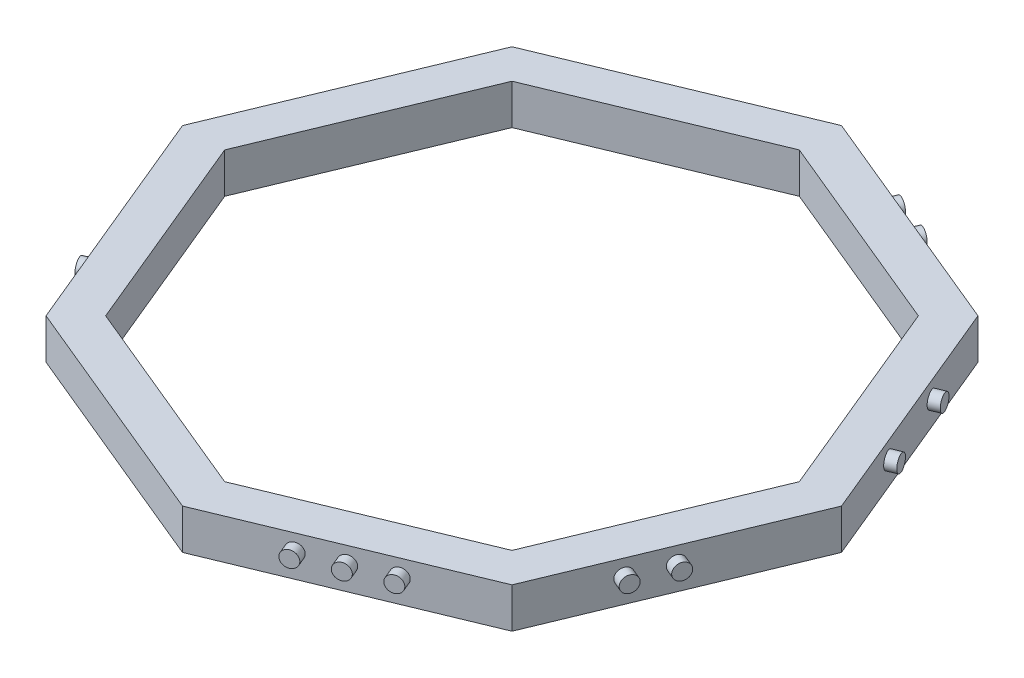
ISO-10303-21;
HEADER;
FILE_DESCRIPTION(('STEP AP214'),'2;1');
FILE_NAME('part.step','',(''),(''),'','','');
FILE_SCHEMA(('AUTOMOTIVE_DESIGN { 1 0 10303 214 1 1 1 1 }'));
ENDSEC;
DATA;
#1=APPLICATION_CONTEXT('core data for automotive mechanical design processes');
#2=APPLICATION_PROTOCOL_DEFINITION('international standard','automotive_design',2000,#1);
#3=PRODUCT_CONTEXT('',#1,'mechanical');
#4=PRODUCT('Part','Part','',(#3));
#5=PRODUCT_RELATED_PRODUCT_CATEGORY('part','',(#4));
#6=PRODUCT_DEFINITION_FORMATION('','',#4);
#7=PRODUCT_DEFINITION_CONTEXT('part definition',#1,'design');
#8=PRODUCT_DEFINITION('design','',#6,#7);
#9=PRODUCT_DEFINITION_SHAPE('','',#8);
#10=(LENGTH_UNIT() NAMED_UNIT(*) SI_UNIT(.MILLI.,.METRE.));
#11=(NAMED_UNIT(*) PLANE_ANGLE_UNIT() SI_UNIT($,.RADIAN.));
#12=(NAMED_UNIT(*) SI_UNIT($,.STERADIAN.) SOLID_ANGLE_UNIT());
#13=UNCERTAINTY_MEASURE_WITH_UNIT(LENGTH_MEASURE(1.E-05),#10,'distance_accuracy_value','');
#14=(GEOMETRIC_REPRESENTATION_CONTEXT(3) GLOBAL_UNCERTAINTY_ASSIGNED_CONTEXT((#13)) GLOBAL_UNIT_ASSIGNED_CONTEXT((#10,
#11,#12)) REPRESENTATION_CONTEXT('',''));
#15=CARTESIAN_POINT('',(0.,0.,0.));
#16=DIRECTION('',(0.,0.,1.));
#17=DIRECTION('',(1.,0.,0.));
#18=AXIS2_PLACEMENT_3D('',#15,#16,#17);
#19=CARTESIAN_POINT('',(28.9913780286488,5.,28.9913780286481));
#20=DIRECTION('',(-0.923879532511291,0.,-0.38268343236508));
#21=DIRECTION('',(-0.38268343236508,0.,0.923879532511291));
#22=AXIS2_PLACEMENT_3D('',#19,#20,#21);
#23=PLANE('',#22);
#24=CARTESIAN_POINT('',(34.9956890143244,3.,14.4956890143238));
#25=DIRECTION('',(-0.923879532511291,0.,-0.38268343236508));
#26=DIRECTION('',(-0.38268343236508,0.,0.923879532511291));
#27=AXIS2_PLACEMENT_3D('',#24,#25,#26);
#28=CIRCLE('',#27,1.);
#29=CARTESIAN_POINT('',(34.6130055819593,3.,15.4195685468351));
#30=VERTEX_POINT('',#29);
#31=EDGE_CURVE('E11',#30,#30,#28,.F.);
#32=ORIENTED_EDGE('',*,*,#31,.F.);
#33=EDGE_LOOP('',(#32));
#34=FACE_BOUND('',#33,.T.);
#35=CARTESIAN_POINT('',(33.082271852499,3.,19.1150866768803));
#36=DIRECTION('',(-0.923879532511291,0.,-0.38268343236508));
#37=DIRECTION('',(-0.38268343236508,0.,0.923879532511291));
#38=AXIS2_PLACEMENT_3D('',#35,#36,#37);
#39=CIRCLE('',#38,1.);
#40=CARTESIAN_POINT('',(32.6995884201339,3.,20.0389662093916));
#41=VERTEX_POINT('',#40);
#42=EDGE_CURVE('E40',#41,#41,#39,.F.);
#43=ORIENTED_EDGE('',*,*,#42,.F.);
#44=EDGE_LOOP('',(#43));
#45=FACE_BOUND('',#44,.T.);
#46=DIRECTION('',(0.38268343236508,0.,-0.923879532511291));
#47=VECTOR('',#46,1.);
#48=CARTESIAN_POINT('',(28.9913780286488,0.,28.9913780286481));
#49=LINE('',#48,#47);
#50=CARTESIAN_POINT('',(28.9913780286488,0.,28.9913780286481));
#51=VERTEX_POINT('',#50);
#52=CARTESIAN_POINT('',(41.,0.,-4.48023070960939E-13));
#53=VERTEX_POINT('',#52);
#54=EDGE_CURVE('E205',#51,#53,#49,.T.);
#55=ORIENTED_EDGE('',*,*,#54,.T.);
#56=DIRECTION('',(0.,-1.,0.));
#57=VECTOR('',#56,1.);
#58=CARTESIAN_POINT('',(41.,5.,-4.48023070960939E-13));
#59=LINE('',#58,#57);
#60=CARTESIAN_POINT('',(41.,5.,-4.48023070960939E-13));
#61=VERTEX_POINT('',#60);
#62=EDGE_CURVE('E271',#61,#53,#59,.T.);
#63=ORIENTED_EDGE('',*,*,#62,.F.);
#64=DIRECTION('',(0.38268343236508,0.,-0.923879532511291));
#65=VECTOR('',#64,1.);
#66=CARTESIAN_POINT('',(28.9913780286488,5.,28.9913780286481));
#67=LINE('',#66,#65);
#68=CARTESIAN_POINT('',(28.9913780286488,5.,28.9913780286481));
#69=VERTEX_POINT('',#68);
#70=EDGE_CURVE('E217',#69,#61,#67,.T.);
#71=ORIENTED_EDGE('',*,*,#70,.F.);
#72=DIRECTION('',(0.,-1.,0.));
#73=VECTOR('',#72,1.);
#74=CARTESIAN_POINT('',(28.9913780286488,5.,28.9913780286481));
#75=LINE('',#74,#73);
#76=EDGE_CURVE('E235',#69,#51,#75,.T.);
#77=ORIENTED_EDGE('',*,*,#76,.T.);
#78=EDGE_LOOP('',(#55,#63,#71,#77));
#79=FACE_BOUND('',#78,.T.);
#80=ADVANCED_FACE('F33',(#34,#45,#79),#23,.F.);
#81=CARTESIAN_POINT('',(41.,5.,-4.48023070960939E-13));
#82=DIRECTION('',(-0.923879532511283,0.,0.3826834323651));
#83=DIRECTION('',(0.3826834323651,0.,0.923879532511283));
#84=AXIS2_PLACEMENT_3D('',#81,#82,#83);
#85=PLANE('',#84);
#86=CARTESIAN_POINT('',(33.0822718524986,3.,-19.115086676881));
#87=DIRECTION('',(-0.923879532511283,0.,0.3826834323651));
#88=DIRECTION('',(0.3826834323651,0.,0.923879532511283));
#89=AXIS2_PLACEMENT_3D('',#86,#87,#88);
#90=CIRCLE('',#89,1.);
#91=CARTESIAN_POINT('',(33.4649552848637,3.,-18.1912071443697));
#92=VERTEX_POINT('',#91);
#93=EDGE_CURVE('E301',#92,#92,#90,.F.);
#94=ORIENTED_EDGE('',*,*,#93,.F.);
#95=EDGE_LOOP('',(#94));
#96=FACE_BOUND('',#95,.T.);
#97=CARTESIAN_POINT('',(36.9091061761496,3.,-9.8762913517682));
#98=DIRECTION('',(-0.923879532511283,0.,0.3826834323651));
#99=DIRECTION('',(0.3826834323651,0.,0.923879532511283));
#100=AXIS2_PLACEMENT_3D('',#97,#98,#99);
#101=CIRCLE('',#100,1.);
#102=CARTESIAN_POINT('',(37.2917896085147,3.,-8.95241181925691));
#103=VERTEX_POINT('',#102);
#104=EDGE_CURVE('E298',#103,#103,#101,.F.);
#105=ORIENTED_EDGE('',*,*,#104,.F.);
#106=EDGE_LOOP('',(#105));
#107=FACE_BOUND('',#106,.T.);
#108=DIRECTION('',(-0.3826834323651,0.,-0.923879532511283));
#109=VECTOR('',#108,1.);
#110=CARTESIAN_POINT('',(41.,0.,-4.48023070960939E-13));
#111=LINE('',#110,#109);
#112=CARTESIAN_POINT('',(28.9913780286481,0.,-28.9913780286488));
#113=VERTEX_POINT('',#112);
#114=EDGE_CURVE('E238',#53,#113,#111,.T.);
#115=ORIENTED_EDGE('',*,*,#114,.T.);
#116=DIRECTION('',(0.,-1.,0.));
#117=VECTOR('',#116,1.);
#118=CARTESIAN_POINT('',(28.9913780286481,5.,-28.9913780286488));
#119=LINE('',#118,#117);
#120=CARTESIAN_POINT('',(28.9913780286481,5.,-28.9913780286488));
#121=VERTEX_POINT('',#120);
#122=EDGE_CURVE('E268',#121,#113,#119,.T.);
#123=ORIENTED_EDGE('',*,*,#122,.F.);
#124=DIRECTION('',(-0.3826834323651,0.,-0.923879532511283));
#125=VECTOR('',#124,1.);
#126=CARTESIAN_POINT('',(41.,5.,-4.48023070960939E-13));
#127=LINE('',#126,#125);
#128=EDGE_CURVE('E220',#61,#121,#127,.T.);
#129=ORIENTED_EDGE('',*,*,#128,.F.);
#130=ORIENTED_EDGE('',*,*,#62,.T.);
#131=EDGE_LOOP('',(#115,#123,#129,#130));
#132=FACE_BOUND('',#131,.T.);
#133=ADVANCED_FACE('F310',(#96,#107,#132),#85,.F.);
#134=CARTESIAN_POINT('',(28.9913780286481,5.,-28.9913780286488));
#135=DIRECTION('',(-0.38268343236508,0.,0.923879532511291));
#136=DIRECTION('',(0.923879532511291,0.,0.38268343236508));
#137=AXIS2_PLACEMENT_3D('',#134,#135,#136);
#138=PLANE('',#137);
#139=CARTESIAN_POINT('',(9.87629135176739,3.,-36.9091061761498));
#140=DIRECTION('',(-0.38268343236508,0.,0.923879532511291));
#141=DIRECTION('',(0.923879532511291,0.,0.38268343236508));
#142=AXIS2_PLACEMENT_3D('',#139,#140,#141);
#143=CIRCLE('',#142,0.999999999999998);
#144=CARTESIAN_POINT('',(10.8001708842787,3.,-36.5264227437847));
#145=VERTEX_POINT('',#144);
#146=EDGE_CURVE('E295',#145,#145,#143,.F.);
#147=ORIENTED_EDGE('',*,*,#146,.F.);
#148=EDGE_LOOP('',(#147));
#149=FACE_BOUND('',#148,.T.);
#150=CARTESIAN_POINT('',(14.4956890143238,3.,-34.9956890143244));
#151=DIRECTION('',(-0.38268343236508,0.,0.923879532511291));
#152=DIRECTION('',(0.923879532511291,0.,0.38268343236508));
#153=AXIS2_PLACEMENT_3D('',#150,#151,#152);
#154=CIRCLE('',#153,1.);
#155=CARTESIAN_POINT('',(15.4195685468351,3.,-34.6130055819593));
#156=VERTEX_POINT('',#155);
#157=EDGE_CURVE('E292',#156,#156,#154,.F.);
#158=ORIENTED_EDGE('',*,*,#157,.F.);
#159=EDGE_LOOP('',(#158));
#160=FACE_BOUND('',#159,.T.);
#161=DIRECTION('',(-0.923879532511291,0.,-0.38268343236508));
#162=VECTOR('',#161,1.);
#163=CARTESIAN_POINT('',(28.9913780286481,0.,-28.9913780286488));
#164=LINE('',#163,#162);
#165=CARTESIAN_POINT('',(-4.51771650624012E-13,0.,-41.));
#166=VERTEX_POINT('',#165);
#167=EDGE_CURVE('E240',#113,#166,#164,.T.);
#168=ORIENTED_EDGE('',*,*,#167,.T.);
#169=DIRECTION('',(0.,-1.,0.));
#170=VECTOR('',#169,1.);
#171=CARTESIAN_POINT('',(-4.51771650624012E-13,5.,-41.));
#172=LINE('',#171,#170);
#173=CARTESIAN_POINT('',(-4.51771650624012E-13,5.,-41.));
#174=VERTEX_POINT('',#173);
#175=EDGE_CURVE('E265',#174,#166,#172,.T.);
#176=ORIENTED_EDGE('',*,*,#175,.F.);
#177=DIRECTION('',(-0.923879532511291,0.,-0.38268343236508));
#178=VECTOR('',#177,1.);
#179=CARTESIAN_POINT('',(28.9913780286481,5.,-28.9913780286488));
#180=LINE('',#179,#178);
#181=EDGE_CURVE('E223',#121,#174,#180,.T.);
#182=ORIENTED_EDGE('',*,*,#181,.F.);
#183=ORIENTED_EDGE('',*,*,#122,.T.);
#184=EDGE_LOOP('',(#168,#176,#182,#183));
#185=FACE_BOUND('',#184,.T.);
#186=ADVANCED_FACE('F348',(#149,#160,#185),#138,.F.);
#187=CARTESIAN_POINT('',(-4.51771650624012E-13,5.,-41.));
#188=DIRECTION('',(0.3826834323651,0.,0.923879532511283));
#189=DIRECTION('',(0.923879532511283,0.,-0.3826834323651));
#190=AXIS2_PLACEMENT_3D('',#187,#188,#189);
#191=PLANE('',#190);
#192=CARTESIAN_POINT('',(-9.8762913517682,3.,-36.9091061761496));
#193=DIRECTION('',(0.3826834323651,0.,0.923879532511283));
#194=DIRECTION('',(0.923879532511283,0.,-0.3826834323651));
#195=AXIS2_PLACEMENT_3D('',#192,#193,#194);
#196=CIRCLE('',#195,1.);
#197=CARTESIAN_POINT('',(-8.95241181925692,3.,-37.2917896085147));
#198=VERTEX_POINT('',#197);
#199=EDGE_CURVE('E289',#198,#198,#196,.F.);
#200=ORIENTED_EDGE('',*,*,#199,.F.);
#201=EDGE_LOOP('',(#200));
#202=FACE_BOUND('',#201,.T.);
#203=DIRECTION('',(-0.923879532511283,0.,0.3826834323651));
#204=VECTOR('',#203,1.);
#205=CARTESIAN_POINT('',(-4.51771650624012E-13,0.,-41.));
#206=LINE('',#205,#204);
#207=CARTESIAN_POINT('',(-28.9913780286488,0.,-28.9913780286481));
#208=VERTEX_POINT('',#207);
#209=EDGE_CURVE('E242',#166,#208,#206,.T.);
#210=ORIENTED_EDGE('',*,*,#209,.T.);
#211=DIRECTION('',(0.,-1.,0.));
#212=VECTOR('',#211,1.);
#213=CARTESIAN_POINT('',(-28.9913780286488,5.,-28.9913780286481));
#214=LINE('',#213,#212);
#215=CARTESIAN_POINT('',(-28.9913780286488,5.,-28.9913780286481));
#216=VERTEX_POINT('',#215);
#217=EDGE_CURVE('E262',#216,#208,#214,.T.);
#218=ORIENTED_EDGE('',*,*,#217,.F.);
#219=DIRECTION('',(-0.923879532511283,0.,0.3826834323651));
#220=VECTOR('',#219,1.);
#221=CARTESIAN_POINT('',(-4.51771650624012E-13,5.,-41.));
#222=LINE('',#221,#220);
#223=EDGE_CURVE('E225',#174,#216,#222,.T.);
#224=ORIENTED_EDGE('',*,*,#223,.F.);
#225=ORIENTED_EDGE('',*,*,#175,.T.);
#226=EDGE_LOOP('',(#210,#218,#224,#225));
#227=FACE_BOUND('',#226,.T.);
#228=ADVANCED_FACE('F345',(#202,#227),#191,.F.);
#229=CARTESIAN_POINT('',(-28.9913780286488,5.,-28.9913780286481));
#230=DIRECTION('',(0.923879532511291,0.,0.38268343236508));
#231=DIRECTION('',(0.38268343236508,0.,-0.923879532511291));
#232=AXIS2_PLACEMENT_3D('',#229,#230,#231);
#233=PLANE('',#232);
#234=CARTESIAN_POINT('',(-34.9956890143244,3.,-14.4956890143239));
#235=DIRECTION('',(0.923879532511291,0.,0.38268343236508));
#236=DIRECTION('',(0.38268343236508,0.,-0.923879532511291));
#237=AXIS2_PLACEMENT_3D('',#234,#235,#236);
#238=CIRCLE('',#237,0.999999999999998);
#239=CARTESIAN_POINT('',(-34.6130055819593,3.,-15.4195685468351));
#240=VERTEX_POINT('',#239);
#241=EDGE_CURVE('E286',#240,#240,#238,.F.);
#242=ORIENTED_EDGE('',*,*,#241,.F.);
#243=EDGE_LOOP('',(#242));
#244=FACE_BOUND('',#243,.T.);
#245=DIRECTION('',(-0.38268343236508,0.,0.923879532511291));
#246=VECTOR('',#245,1.);
#247=CARTESIAN_POINT('',(-28.9913780286488,0.,-28.9913780286481));
#248=LINE('',#247,#246);
#249=CARTESIAN_POINT('',(-41.,0.,4.3736829323662E-13));
#250=VERTEX_POINT('',#249);
#251=EDGE_CURVE('E244',#208,#250,#248,.T.);
#252=ORIENTED_EDGE('',*,*,#251,.T.);
#253=DIRECTION('',(0.,-1.,0.));
#254=VECTOR('',#253,1.);
#255=CARTESIAN_POINT('',(-41.,5.,4.3736829323662E-13));
#256=LINE('',#255,#254);
#257=CARTESIAN_POINT('',(-41.,5.,4.3736829323662E-13));
#258=VERTEX_POINT('',#257);
#259=EDGE_CURVE('E259',#258,#250,#256,.T.);
#260=ORIENTED_EDGE('',*,*,#259,.F.);
#261=DIRECTION('',(-0.38268343236508,0.,0.923879532511291));
#262=VECTOR('',#261,1.);
#263=CARTESIAN_POINT('',(-28.9913780286488,5.,-28.9913780286481));
#264=LINE('',#263,#262);
#265=EDGE_CURVE('E227',#216,#258,#264,.T.);
#266=ORIENTED_EDGE('',*,*,#265,.F.);
#267=ORIENTED_EDGE('',*,*,#217,.T.);
#268=EDGE_LOOP('',(#252,#260,#266,#267));
#269=FACE_BOUND('',#268,.T.);
#270=ADVANCED_FACE('F341',(#244,#269),#233,.F.);
#271=CARTESIAN_POINT('',(-41.,5.,4.3736829323662E-13));
#272=DIRECTION('',(0.923879532511283,0.,-0.3826834323651));
#273=DIRECTION('',(-0.3826834323651,0.,-0.923879532511283));
#274=AXIS2_PLACEMENT_3D('',#271,#272,#273);
#275=PLANE('',#274);
#276=CARTESIAN_POINT('',(-33.0822718524986,3.,19.115086676881));
#277=DIRECTION('',(0.923879532511283,0.,-0.3826834323651));
#278=DIRECTION('',(-0.3826834323651,0.,-0.923879532511283));
#279=AXIS2_PLACEMENT_3D('',#276,#277,#278);
#280=CIRCLE('',#279,1.);
#281=CARTESIAN_POINT('',(-33.4649552848637,3.,18.1912071443697));
#282=VERTEX_POINT('',#281);
#283=EDGE_CURVE('E283',#282,#282,#280,.F.);
#284=ORIENTED_EDGE('',*,*,#283,.F.);
#285=EDGE_LOOP('',(#284));
#286=FACE_BOUND('',#285,.T.);
#287=DIRECTION('',(0.3826834323651,0.,0.923879532511283));
#288=VECTOR('',#287,1.);
#289=CARTESIAN_POINT('',(-41.,0.,4.3736829323662E-13));
#290=LINE('',#289,#288);
#291=CARTESIAN_POINT('',(-28.9913780286481,0.,28.9913780286488));
#292=VERTEX_POINT('',#291);
#293=EDGE_CURVE('E246',#250,#292,#290,.T.);
#294=ORIENTED_EDGE('',*,*,#293,.T.);
#295=DIRECTION('',(0.,-1.,0.));
#296=VECTOR('',#295,1.);
#297=CARTESIAN_POINT('',(-28.9913780286481,5.,28.9913780286488));
#298=LINE('',#297,#296);
#299=CARTESIAN_POINT('',(-28.9913780286481,5.,28.9913780286488));
#300=VERTEX_POINT('',#299);
#301=EDGE_CURVE('E256',#300,#292,#298,.T.);
#302=ORIENTED_EDGE('',*,*,#301,.F.);
#303=DIRECTION('',(0.3826834323651,0.,0.923879532511283));
#304=VECTOR('',#303,1.);
#305=CARTESIAN_POINT('',(-41.,5.,4.3736829323662E-13));
#306=LINE('',#305,#304);
#307=EDGE_CURVE('E229',#258,#300,#306,.T.);
#308=ORIENTED_EDGE('',*,*,#307,.F.);
#309=ORIENTED_EDGE('',*,*,#259,.T.);
#310=EDGE_LOOP('',(#294,#302,#308,#309));
#311=FACE_BOUND('',#310,.T.);
#312=ADVANCED_FACE('F336',(#286,#311),#275,.F.);
#313=CARTESIAN_POINT('',(-28.9913780286481,5.,28.9913780286488));
#314=DIRECTION('',(0.382683432365079,0.,-0.923879532511291));
#315=DIRECTION('',(-0.923879532511291,0.,-0.382683432365079));
#316=AXIS2_PLACEMENT_3D('',#313,#314,#315);
#317=PLANE('',#316);
#318=DIRECTION('',(0.923879532511291,0.,0.382683432365079));
#319=VECTOR('',#318,1.);
#320=CARTESIAN_POINT('',(-28.9913780286481,0.,28.9913780286488));
#321=LINE('',#320,#319);
#322=CARTESIAN_POINT('',(4.40747933146162E-13,0.,41.));
#323=VERTEX_POINT('',#322);
#324=EDGE_CURVE('E248',#292,#323,#321,.T.);
#325=ORIENTED_EDGE('',*,*,#324,.T.);
#326=DIRECTION('',(0.,-1.,0.));
#327=VECTOR('',#326,1.);
#328=CARTESIAN_POINT('',(4.40747933146162E-13,5.,41.));
#329=LINE('',#328,#327);
#330=CARTESIAN_POINT('',(4.40747933146162E-13,5.,41.));
#331=VERTEX_POINT('',#330);
#332=EDGE_CURVE('E253',#331,#323,#329,.T.);
#333=ORIENTED_EDGE('',*,*,#332,.F.);
#334=DIRECTION('',(0.923879532511291,0.,0.382683432365079));
#335=VECTOR('',#334,1.);
#336=CARTESIAN_POINT('',(-28.9913780286481,5.,28.9913780286488));
#337=LINE('',#336,#335);
#338=EDGE_CURVE('E231',#300,#331,#337,.T.);
#339=ORIENTED_EDGE('',*,*,#338,.F.);
#340=ORIENTED_EDGE('',*,*,#301,.T.);
#341=EDGE_LOOP('',(#325,#333,#339,#340));
#342=FACE_BOUND('',#341,.T.);
#343=ADVANCED_FACE('F331',(#342),#317,.F.);
#344=CARTESIAN_POINT('',(4.40747933146162E-13,5.,41.));
#345=DIRECTION('',(-0.3826834323651,0.,-0.923879532511283));
#346=DIRECTION('',(-0.923879532511283,0.,0.3826834323651));
#347=AXIS2_PLACEMENT_3D('',#344,#345,#346);
#348=PLANE('',#347);
#349=CARTESIAN_POINT('',(14.4956890143246,3.,34.9956890143241));
#350=DIRECTION('',(-0.3826834323651,0.,-0.923879532511283));
#351=DIRECTION('',(-0.923879532511283,0.,0.3826834323651));
#352=AXIS2_PLACEMENT_3D('',#349,#350,#351);
#353=CIRCLE('',#352,1.);
#354=CARTESIAN_POINT('',(13.5718094818133,3.,35.3783724466892));
#355=VERTEX_POINT('',#354);
#356=EDGE_CURVE('E280',#355,#355,#353,.F.);
#357=ORIENTED_EDGE('',*,*,#356,.F.);
#358=EDGE_LOOP('',(#357));
#359=FACE_BOUND('',#358,.T.);
#360=CARTESIAN_POINT('',(9.87629135176818,3.,36.9091061761496));
#361=DIRECTION('',(-0.3826834323651,0.,-0.923879532511283));
#362=DIRECTION('',(-0.923879532511283,0.,0.3826834323651));
#363=AXIS2_PLACEMENT_3D('',#360,#361,#362);
#364=CIRCLE('',#363,1.);
#365=CARTESIAN_POINT('',(8.9524118192569,3.,37.2917896085147));
#366=VERTEX_POINT('',#365);
#367=EDGE_CURVE('E277',#366,#366,#364,.F.);
#368=ORIENTED_EDGE('',*,*,#367,.F.);
#369=EDGE_LOOP('',(#368));
#370=FACE_BOUND('',#369,.T.);
#371=CARTESIAN_POINT('',(19.115086676881,3.,33.0822718524986));
#372=DIRECTION('',(-0.3826834323651,0.,-0.923879532511283));
#373=DIRECTION('',(-0.923879532511283,0.,0.3826834323651));
#374=AXIS2_PLACEMENT_3D('',#371,#372,#373);
#375=CIRCLE('',#374,1.);
#376=CARTESIAN_POINT('',(18.1912071443697,3.,33.4649552848637));
#377=VERTEX_POINT('',#376);
#378=EDGE_CURVE('E274',#377,#377,#375,.F.);
#379=ORIENTED_EDGE('',*,*,#378,.F.);
#380=EDGE_LOOP('',(#379));
#381=FACE_BOUND('',#380,.T.);
#382=DIRECTION('',(0.923879532511283,0.,-0.3826834323651));
#383=VECTOR('',#382,1.);
#384=CARTESIAN_POINT('',(4.40747933146162E-13,0.,41.));
#385=LINE('',#384,#383);
#386=EDGE_CURVE('E221',#323,#51,#385,.T.);
#387=ORIENTED_EDGE('',*,*,#386,.T.);
#388=ORIENTED_EDGE('',*,*,#76,.F.);
#389=DIRECTION('',(0.923879532511283,0.,-0.3826834323651));
#390=VECTOR('',#389,1.);
#391=CARTESIAN_POINT('',(4.40747933146162E-13,5.,41.));
#392=LINE('',#391,#390);
#393=EDGE_CURVE('E233',#331,#69,#392,.T.);
#394=ORIENTED_EDGE('',*,*,#393,.F.);
#395=ORIENTED_EDGE('',*,*,#332,.T.);
#396=EDGE_LOOP('',(#387,#388,#394,#395));
#397=FACE_BOUND('',#396,.T.);
#398=ADVANCED_FACE('F329',(#359,#370,#381,#397),#348,.F.);
#399=CARTESIAN_POINT('',(0.,5.,0.));
#400=DIRECTION('',(0.,1.,0.));
#401=DIRECTION('',(0.,0.,1.));
#402=AXIS2_PLACEMENT_3D('',#399,#400,#401);
#403=PLANE('',#402);
#404=DIRECTION('',(0.382683432365079,0.,-0.923879532511291));
#405=VECTOR('',#404,1.);
#406=CARTESIAN_POINT('',(25.2790674274194,5.,25.2790674274188));
#407=LINE('',#406,#405);
#408=CARTESIAN_POINT('',(25.2790674274194,5.,25.2790674274188));
#409=VERTEX_POINT('',#408);
#410=CARTESIAN_POINT('',(35.75,5.,-4.16333634234434E-13));
#411=VERTEX_POINT('',#410);
#412=EDGE_CURVE('E47',#409,#411,#407,.T.);
#413=ORIENTED_EDGE('',*,*,#412,.F.);
#414=DIRECTION('',(0.923879532511282,0.,-0.3826834323651));
#415=VECTOR('',#414,1.);
#416=CARTESIAN_POINT('',(4.22971071691175E-13,5.,35.75));
#417=LINE('',#416,#415);
#418=CARTESIAN_POINT('',(4.22971071691175E-13,5.,35.75));
#419=VERTEX_POINT('',#418);
#420=EDGE_CURVE('E164',#419,#409,#417,.T.);
#421=ORIENTED_EDGE('',*,*,#420,.F.);
#422=DIRECTION('',(0.923879532511291,0.,0.382683432365079));
#423=VECTOR('',#422,1.);
#424=CARTESIAN_POINT('',(-25.2790674274188,5.,25.2790674274194));
#425=LINE('',#424,#423);
#426=CARTESIAN_POINT('',(-25.2790674274188,5.,25.2790674274194));
#427=VERTEX_POINT('',#426);
#428=EDGE_CURVE('E167',#427,#419,#425,.T.);
#429=ORIENTED_EDGE('',*,*,#428,.F.);
#430=DIRECTION('',(0.382683432365101,0.,0.923879532511282));
#431=VECTOR('',#430,1.);
#432=CARTESIAN_POINT('',(-35.75,5.,4.23238986687175E-13));
#433=LINE('',#432,#431);
#434=CARTESIAN_POINT('',(-35.75,5.,4.23238986687175E-13));
#435=VERTEX_POINT('',#434);
#436=EDGE_CURVE('E198',#435,#427,#433,.T.);
#437=ORIENTED_EDGE('',*,*,#436,.F.);
#438=DIRECTION('',(-0.382683432365079,0.,0.923879532511291));
#439=VECTOR('',#438,1.);
#440=CARTESIAN_POINT('',(-25.2790674274194,5.,-25.2790674274188));
#441=LINE('',#440,#439);
#442=CARTESIAN_POINT('',(-25.2790674274194,5.,-25.2790674274188));
#443=VERTEX_POINT('',#442);
#444=EDGE_CURVE('E195',#443,#435,#441,.T.);
#445=ORIENTED_EDGE('',*,*,#444,.F.);
#446=DIRECTION('',(-0.923879532511282,0.,0.3826834323651));
#447=VECTOR('',#446,1.);
#448=CARTESIAN_POINT('',(-4.16338199698302E-13,5.,-35.75));
#449=LINE('',#448,#447);
#450=CARTESIAN_POINT('',(-4.16338199698302E-13,5.,-35.75));
#451=VERTEX_POINT('',#450);
#452=EDGE_CURVE('E192',#451,#443,#449,.T.);
#453=ORIENTED_EDGE('',*,*,#452,.F.);
#454=DIRECTION('',(-0.923879532511291,0.,-0.382683432365079));
#455=VECTOR('',#454,1.);
#456=CARTESIAN_POINT('',(25.2790674274188,5.,-25.2790674274194));
#457=LINE('',#456,#455);
#458=CARTESIAN_POINT('',(25.2790674274188,5.,-25.2790674274194));
#459=VERTEX_POINT('',#458);
#460=EDGE_CURVE('E189',#459,#451,#457,.T.);
#461=ORIENTED_EDGE('',*,*,#460,.F.);
#462=DIRECTION('',(-0.382683432365101,0.,-0.923879532511282));
#463=VECTOR('',#462,1.);
#464=CARTESIAN_POINT('',(35.75,5.,-4.15771681559117E-13));
#465=LINE('',#464,#463);
#466=EDGE_CURVE('E187',#411,#459,#465,.T.);
#467=ORIENTED_EDGE('',*,*,#466,.F.);
#468=EDGE_LOOP('',(#413,#421,#429,#437,#445,#453,#461,#467));
#469=FACE_BOUND('',#468,.T.);
#470=ORIENTED_EDGE('',*,*,#70,.T.);
#471=ORIENTED_EDGE('',*,*,#128,.T.);
#472=ORIENTED_EDGE('',*,*,#181,.T.);
#473=ORIENTED_EDGE('',*,*,#223,.T.);
#474=ORIENTED_EDGE('',*,*,#265,.T.);
#475=ORIENTED_EDGE('',*,*,#307,.T.);
#476=ORIENTED_EDGE('',*,*,#338,.T.);
#477=ORIENTED_EDGE('',*,*,#393,.T.);
#478=EDGE_LOOP('',(#470,#471,#472,#473,#474,#475,#476,#477));
#479=FACE_BOUND('',#478,.T.);
#480=ADVANCED_FACE('F324',(#469,#479),#403,.T.);
#481=CARTESIAN_POINT('',(0.,0.,0.));
#482=DIRECTION('',(0.,1.,0.));
#483=DIRECTION('',(0.,0.,1.));
#484=AXIS2_PLACEMENT_3D('',#481,#482,#483);
#485=PLANE('',#484);
#486=DIRECTION('',(0.923879532511282,0.,-0.3826834323651));
#487=VECTOR('',#486,1.);
#488=CARTESIAN_POINT('',(4.22971071691175E-13,0.,35.75));
#489=LINE('',#488,#487);
#490=CARTESIAN_POINT('',(4.22971071691175E-13,0.,35.75));
#491=VERTEX_POINT('',#490);
#492=CARTESIAN_POINT('',(25.2790674274194,0.,25.2790674274188));
#493=VERTEX_POINT('',#492);
#494=EDGE_CURVE('E153',#491,#493,#489,.T.);
#495=ORIENTED_EDGE('',*,*,#494,.T.);
#496=DIRECTION('',(0.382683432365079,0.,-0.923879532511291));
#497=VECTOR('',#496,1.);
#498=CARTESIAN_POINT('',(25.2790674274194,0.,25.2790674274188));
#499=LINE('',#498,#497);
#500=CARTESIAN_POINT('',(35.75,0.,-4.15771681559117E-13));
#501=VERTEX_POINT('',#500);
#502=EDGE_CURVE('E147',#493,#501,#499,.T.);
#503=ORIENTED_EDGE('',*,*,#502,.T.);
#504=DIRECTION('',(-0.382683432365101,0.,-0.923879532511282));
#505=VECTOR('',#504,1.);
#506=CARTESIAN_POINT('',(35.75,0.,-4.15771681559117E-13));
#507=LINE('',#506,#505);
#508=CARTESIAN_POINT('',(25.2790674274188,0.,-25.2790674274194));
#509=VERTEX_POINT('',#508);
#510=EDGE_CURVE('E156',#501,#509,#507,.T.);
#511=ORIENTED_EDGE('',*,*,#510,.T.);
#512=DIRECTION('',(-0.923879532511291,0.,-0.382683432365079));
#513=VECTOR('',#512,1.);
#514=CARTESIAN_POINT('',(25.2790674274188,0.,-25.2790674274194));
#515=LINE('',#514,#513);
#516=CARTESIAN_POINT('',(-4.16338199698302E-13,0.,-35.75));
#517=VERTEX_POINT('',#516);
#518=EDGE_CURVE('E55',#509,#517,#515,.T.);
#519=ORIENTED_EDGE('',*,*,#518,.T.);
#520=DIRECTION('',(-0.923879532511282,0.,0.3826834323651));
#521=VECTOR('',#520,1.);
#522=CARTESIAN_POINT('',(-4.16338199698302E-13,0.,-35.75));
#523=LINE('',#522,#521);
#524=CARTESIAN_POINT('',(-25.2790674274194,0.,-25.2790674274188));
#525=VERTEX_POINT('',#524);
#526=EDGE_CURVE('E174',#517,#525,#523,.T.);
#527=ORIENTED_EDGE('',*,*,#526,.T.);
#528=DIRECTION('',(-0.382683432365079,0.,0.923879532511291));
#529=VECTOR('',#528,1.);
#530=CARTESIAN_POINT('',(-25.2790674274194,0.,-25.2790674274188));
#531=LINE('',#530,#529);
#532=CARTESIAN_POINT('',(-35.75,0.,4.23238986687175E-13));
#533=VERTEX_POINT('',#532);
#534=EDGE_CURVE('E177',#525,#533,#531,.T.);
#535=ORIENTED_EDGE('',*,*,#534,.T.);
#536=DIRECTION('',(0.382683432365101,0.,0.923879532511282));
#537=VECTOR('',#536,1.);
#538=CARTESIAN_POINT('',(-35.75,0.,4.23238986687175E-13));
#539=LINE('',#538,#537);
#540=CARTESIAN_POINT('',(-25.2790674274188,0.,25.2790674274194));
#541=VERTEX_POINT('',#540);
#542=EDGE_CURVE('E180',#533,#541,#539,.T.);
#543=ORIENTED_EDGE('',*,*,#542,.T.);
#544=DIRECTION('',(0.923879532511291,0.,0.382683432365079));
#545=VECTOR('',#544,1.);
#546=CARTESIAN_POINT('',(-25.2790674274188,0.,25.2790674274194));
#547=LINE('',#546,#545);
#548=EDGE_CURVE('E183',#541,#491,#547,.T.);
#549=ORIENTED_EDGE('',*,*,#548,.T.);
#550=EDGE_LOOP('',(#495,#503,#511,#519,#527,#535,#543,#549));
#551=FACE_BOUND('',#550,.T.);
#552=ORIENTED_EDGE('',*,*,#54,.F.);
#553=ORIENTED_EDGE('',*,*,#386,.F.);
#554=ORIENTED_EDGE('',*,*,#324,.F.);
#555=ORIENTED_EDGE('',*,*,#293,.F.);
#556=ORIENTED_EDGE('',*,*,#251,.F.);
#557=ORIENTED_EDGE('',*,*,#209,.F.);
#558=ORIENTED_EDGE('',*,*,#167,.F.);
#559=ORIENTED_EDGE('',*,*,#114,.F.);
#560=EDGE_LOOP('',(#552,#553,#554,#555,#556,#557,#558,#559));
#561=FACE_BOUND('',#560,.T.);
#562=ADVANCED_FACE('F160',(#551,#561),#485,.F.);
#563=CARTESIAN_POINT('',(25.2790674274194,0.,25.2790674274188));
#564=DIRECTION('',(0.923879532511291,0.,0.382683432365079));
#565=DIRECTION('',(0.382683432365079,0.,-0.923879532511291));
#566=AXIS2_PLACEMENT_3D('',#563,#564,#565);
#567=PLANE('',#566);
#568=ORIENTED_EDGE('',*,*,#412,.T.);
#569=DIRECTION('',(0.,1.,0.));
#570=VECTOR('',#569,1.);
#571=CARTESIAN_POINT('',(35.75,0.,-4.15771681559117E-13));
#572=LINE('',#571,#570);
#573=EDGE_CURVE('E143',#501,#411,#572,.T.);
#574=ORIENTED_EDGE('',*,*,#573,.F.);
#575=ORIENTED_EDGE('',*,*,#502,.F.);
#576=DIRECTION('',(0.,1.,0.));
#577=VECTOR('',#576,1.);
#578=CARTESIAN_POINT('',(25.2790674274194,0.,25.2790674274188));
#579=LINE('',#578,#577);
#580=EDGE_CURVE('E203',#493,#409,#579,.T.);
#581=ORIENTED_EDGE('',*,*,#580,.T.);
#582=EDGE_LOOP('',(#568,#574,#575,#581));
#583=FACE_BOUND('',#582,.T.);
#584=ADVANCED_FACE('F145',(#583),#567,.F.);
#585=CARTESIAN_POINT('',(4.22971071691175E-13,0.,35.75));
#586=DIRECTION('',(0.3826834323651,0.,0.923879532511282));
#587=DIRECTION('',(0.923879532511282,0.,-0.3826834323651));
#588=AXIS2_PLACEMENT_3D('',#585,#586,#587);
#589=PLANE('',#588);
#590=ORIENTED_EDGE('',*,*,#420,.T.);
#591=ORIENTED_EDGE('',*,*,#580,.F.);
#592=ORIENTED_EDGE('',*,*,#494,.F.);
#593=DIRECTION('',(0.,1.,0.));
#594=VECTOR('',#593,1.);
#595=CARTESIAN_POINT('',(4.22971071691175E-13,0.,35.75));
#596=LINE('',#595,#594);
#597=EDGE_CURVE('E206',#491,#419,#596,.T.);
#598=ORIENTED_EDGE('',*,*,#597,.T.);
#599=EDGE_LOOP('',(#590,#591,#592,#598));
#600=FACE_BOUND('',#599,.T.);
#601=ADVANCED_FACE('F380',(#600),#589,.F.);
#602=CARTESIAN_POINT('',(-25.2790674274188,0.,25.2790674274194));
#603=DIRECTION('',(-0.382683432365079,0.,0.923879532511291));
#604=DIRECTION('',(0.923879532511291,0.,0.382683432365079));
#605=AXIS2_PLACEMENT_3D('',#602,#603,#604);
#606=PLANE('',#605);
#607=ORIENTED_EDGE('',*,*,#428,.T.);
#608=ORIENTED_EDGE('',*,*,#597,.F.);
#609=ORIENTED_EDGE('',*,*,#548,.F.);
#610=DIRECTION('',(0.,1.,0.));
#611=VECTOR('',#610,1.);
#612=CARTESIAN_POINT('',(-25.2790674274188,0.,25.2790674274194));
#613=LINE('',#612,#611);
#614=EDGE_CURVE('E208',#541,#427,#613,.T.);
#615=ORIENTED_EDGE('',*,*,#614,.T.);
#616=EDGE_LOOP('',(#607,#608,#609,#615));
#617=FACE_BOUND('',#616,.T.);
#618=ADVANCED_FACE('F398',(#617),#606,.F.);
#619=CARTESIAN_POINT('',(-35.75,0.,4.23238986687175E-13));
#620=DIRECTION('',(-0.923879532511282,0.,0.382683432365101));
#621=DIRECTION('',(0.382683432365101,0.,0.923879532511282));
#622=AXIS2_PLACEMENT_3D('',#619,#620,#621);
#623=PLANE('',#622);
#624=ORIENTED_EDGE('',*,*,#436,.T.);
#625=ORIENTED_EDGE('',*,*,#614,.F.);
#626=ORIENTED_EDGE('',*,*,#542,.F.);
#627=DIRECTION('',(0.,1.,0.));
#628=VECTOR('',#627,1.);
#629=CARTESIAN_POINT('',(-35.75,0.,4.23238986687175E-13));
#630=LINE('',#629,#628);
#631=EDGE_CURVE('E210',#533,#435,#630,.T.);
#632=ORIENTED_EDGE('',*,*,#631,.T.);
#633=EDGE_LOOP('',(#624,#625,#626,#632));
#634=FACE_BOUND('',#633,.T.);
#635=ADVANCED_FACE('F394',(#634),#623,.F.);
#636=CARTESIAN_POINT('',(-25.2790674274194,0.,-25.2790674274188));
#637=DIRECTION('',(-0.923879532511291,0.,-0.382683432365079));
#638=DIRECTION('',(-0.382683432365079,0.,0.923879532511291));
#639=AXIS2_PLACEMENT_3D('',#636,#637,#638);
#640=PLANE('',#639);
#641=ORIENTED_EDGE('',*,*,#444,.T.);
#642=ORIENTED_EDGE('',*,*,#631,.F.);
#643=ORIENTED_EDGE('',*,*,#534,.F.);
#644=DIRECTION('',(0.,1.,0.));
#645=VECTOR('',#644,1.);
#646=CARTESIAN_POINT('',(-25.2790674274194,0.,-25.2790674274188));
#647=LINE('',#646,#645);
#648=EDGE_CURVE('E212',#525,#443,#647,.T.);
#649=ORIENTED_EDGE('',*,*,#648,.T.);
#650=EDGE_LOOP('',(#641,#642,#643,#649));
#651=FACE_BOUND('',#650,.T.);
#652=ADVANCED_FACE('F390',(#651),#640,.F.);
#653=CARTESIAN_POINT('',(-4.16338199698302E-13,0.,-35.75));
#654=DIRECTION('',(-0.3826834323651,0.,-0.923879532511282));
#655=DIRECTION('',(-0.923879532511283,0.,0.3826834323651));
#656=AXIS2_PLACEMENT_3D('',#653,#654,#655);
#657=PLANE('',#656);
#658=ORIENTED_EDGE('',*,*,#452,.T.);
#659=ORIENTED_EDGE('',*,*,#648,.F.);
#660=ORIENTED_EDGE('',*,*,#526,.F.);
#661=DIRECTION('',(0.,1.,0.));
#662=VECTOR('',#661,1.);
#663=CARTESIAN_POINT('',(-4.16338199698302E-13,0.,-35.75));
#664=LINE('',#663,#662);
#665=EDGE_CURVE('E214',#517,#451,#664,.T.);
#666=ORIENTED_EDGE('',*,*,#665,.T.);
#667=EDGE_LOOP('',(#658,#659,#660,#666));
#668=FACE_BOUND('',#667,.T.);
#669=ADVANCED_FACE('F387',(#668),#657,.F.);
#670=CARTESIAN_POINT('',(25.2790674274188,0.,-25.2790674274194));
#671=DIRECTION('',(0.382683432365079,0.,-0.923879532511291));
#672=DIRECTION('',(-0.923879532511292,0.,-0.382683432365079));
#673=AXIS2_PLACEMENT_3D('',#670,#671,#672);
#674=PLANE('',#673);
#675=ORIENTED_EDGE('',*,*,#460,.T.);
#676=ORIENTED_EDGE('',*,*,#665,.F.);
#677=ORIENTED_EDGE('',*,*,#518,.F.);
#678=DIRECTION('',(0.,1.,0.));
#679=VECTOR('',#678,1.);
#680=CARTESIAN_POINT('',(25.2790674274188,0.,-25.2790674274194));
#681=LINE('',#680,#679);
#682=EDGE_CURVE('E152',#509,#459,#681,.T.);
#683=ORIENTED_EDGE('',*,*,#682,.T.);
#684=EDGE_LOOP('',(#675,#676,#677,#683));
#685=FACE_BOUND('',#684,.T.);
#686=ADVANCED_FACE('F384',(#685),#674,.F.);
#687=CARTESIAN_POINT('',(35.75,0.,-4.15771681559117E-13));
#688=DIRECTION('',(0.923879532511282,0.,-0.382683432365101));
#689=DIRECTION('',(-0.382683432365101,0.,-0.923879532511282));
#690=AXIS2_PLACEMENT_3D('',#687,#688,#689);
#691=PLANE('',#690);
#692=ORIENTED_EDGE('',*,*,#466,.T.);
#693=ORIENTED_EDGE('',*,*,#682,.F.);
#694=ORIENTED_EDGE('',*,*,#510,.F.);
#695=ORIENTED_EDGE('',*,*,#573,.T.);
#696=EDGE_LOOP('',(#692,#693,#694,#695));
#697=FACE_BOUND('',#696,.T.);
#698=ADVANCED_FACE('F157',(#697),#691,.F.);
#699=CARTESIAN_POINT('',(19.5934409673374,3.,34.2371212681377));
#700=DIRECTION('',(-0.3826834323651,0.,-0.923879532511283));
#701=DIRECTION('',(-0.923879532511283,0.,0.3826834323651));
#702=AXIS2_PLACEMENT_3D('',#699,#700,#701);
#703=CYLINDRICAL_SURFACE('',#702,1.);
#704=CARTESIAN_POINT('',(19.5934409673374,3.,34.2371212681377));
#705=DIRECTION('',(0.3826834323651,0.,0.923879532511283));
#706=DIRECTION('',(0.923879532511283,0.,-0.3826834323651));
#707=AXIS2_PLACEMENT_3D('',#704,#705,#706);
#708=CIRCLE('',#707,1.);
#709=CARTESIAN_POINT('',(20.5173204998487,3.,33.8544378357726));
#710=VERTEX_POINT('',#709);
#711=EDGE_CURVE('E170',#710,#710,#708,.T.);
#712=ORIENTED_EDGE('',*,*,#711,.F.);
#713=EDGE_LOOP('',(#712));
#714=FACE_BOUND('',#713,.T.);
#715=ORIENTED_EDGE('',*,*,#378,.T.);
#716=EDGE_LOOP('',(#715));
#717=FACE_BOUND('',#716,.T.);
#718=ADVANCED_FACE('F383',(#714,#717),#703,.T.);
#719=CARTESIAN_POINT('',(19.5934409673374,3.,34.2371212681377));
#720=DIRECTION('',(0.3826834323651,0.,0.923879532511283));
#721=DIRECTION('',(0.923879532511283,0.,-0.3826834323651));
#722=AXIS2_PLACEMENT_3D('',#719,#720,#721);
#723=PLANE('',#722);
#724=ORIENTED_EDGE('',*,*,#711,.T.);
#725=EDGE_LOOP('',(#724));
#726=FACE_BOUND('',#725,.T.);
#727=ADVANCED_FACE('F408',(#726),#723,.T.);
#728=CARTESIAN_POINT('',(10.3546456422246,3.,38.0639555917887));
#729=DIRECTION('',(-0.3826834323651,0.,-0.923879532511283));
#730=DIRECTION('',(-0.923879532511283,0.,0.3826834323651));
#731=AXIS2_PLACEMENT_3D('',#728,#729,#730);
#732=CYLINDRICAL_SURFACE('',#731,1.);
#733=CARTESIAN_POINT('',(10.3546456422246,3.,38.0639555917887));
#734=DIRECTION('',(0.3826834323651,0.,0.923879532511283));
#735=DIRECTION('',(0.923879532511283,0.,-0.3826834323651));
#736=AXIS2_PLACEMENT_3D('',#733,#734,#735);
#737=CIRCLE('',#736,1.);
#738=CARTESIAN_POINT('',(11.2785251747358,3.,37.6812721594236));
#739=VERTEX_POINT('',#738);
#740=EDGE_CURVE('E534',#739,#739,#737,.T.);
#741=ORIENTED_EDGE('',*,*,#740,.F.);
#742=EDGE_LOOP('',(#741));
#743=FACE_BOUND('',#742,.T.);
#744=ORIENTED_EDGE('',*,*,#367,.T.);
#745=EDGE_LOOP('',(#744));
#746=FACE_BOUND('',#745,.T.);
#747=ADVANCED_FACE('F412',(#743,#746),#732,.T.);
#748=CARTESIAN_POINT('',(10.3546456422246,3.,38.0639555917887));
#749=DIRECTION('',(0.3826834323651,0.,0.923879532511283));
#750=DIRECTION('',(0.923879532511283,0.,-0.3826834323651));
#751=AXIS2_PLACEMENT_3D('',#748,#749,#750);
#752=PLANE('',#751);
#753=ORIENTED_EDGE('',*,*,#740,.T.);
#754=EDGE_LOOP('',(#753));
#755=FACE_BOUND('',#754,.T.);
#756=ADVANCED_FACE('F414',(#755),#752,.T.);
#757=CARTESIAN_POINT('',(14.974043304781,3.,36.1505384299632));
#758=DIRECTION('',(-0.3826834323651,0.,-0.923879532511283));
#759=DIRECTION('',(-0.923879532511283,0.,0.3826834323651));
#760=AXIS2_PLACEMENT_3D('',#757,#758,#759);
#761=CYLINDRICAL_SURFACE('',#760,1.);
#762=CARTESIAN_POINT('',(14.974043304781,3.,36.1505384299632));
#763=DIRECTION('',(0.3826834323651,0.,0.923879532511283));
#764=DIRECTION('',(0.923879532511283,0.,-0.3826834323651));
#765=AXIS2_PLACEMENT_3D('',#762,#763,#764);
#766=CIRCLE('',#765,1.);
#767=CARTESIAN_POINT('',(15.8979228372923,3.,35.7678549975981));
#768=VERTEX_POINT('',#767);
#769=EDGE_CURVE('E532',#768,#768,#766,.T.);
#770=ORIENTED_EDGE('',*,*,#769,.F.);
#771=EDGE_LOOP('',(#770));
#772=FACE_BOUND('',#771,.T.);
#773=ORIENTED_EDGE('',*,*,#356,.T.);
#774=EDGE_LOOP('',(#773));
#775=FACE_BOUND('',#774,.T.);
#776=ADVANCED_FACE('F417',(#772,#775),#761,.T.);
#777=CARTESIAN_POINT('',(14.974043304781,3.,36.1505384299632));
#778=DIRECTION('',(0.3826834323651,0.,0.923879532511283));
#779=DIRECTION('',(0.923879532511283,0.,-0.3826834323651));
#780=AXIS2_PLACEMENT_3D('',#777,#778,#779);
#781=PLANE('',#780);
#782=ORIENTED_EDGE('',*,*,#769,.T.);
#783=EDGE_LOOP('',(#782));
#784=FACE_BOUND('',#783,.T.);
#785=ADVANCED_FACE('F422',(#784),#781,.T.);
#786=CARTESIAN_POINT('',(-34.2371212681377,3.,19.5934409673374));
#787=DIRECTION('',(0.923879532511283,0.,-0.3826834323651));
#788=DIRECTION('',(-0.3826834323651,0.,-0.923879532511283));
#789=AXIS2_PLACEMENT_3D('',#786,#787,#788);
#790=CYLINDRICAL_SURFACE('',#789,1.);
#791=CARTESIAN_POINT('',(-34.2371212681377,3.,19.5934409673374));
#792=DIRECTION('',(-0.923879532511283,0.,0.3826834323651));
#793=DIRECTION('',(0.3826834323651,0.,0.923879532511283));
#794=AXIS2_PLACEMENT_3D('',#791,#792,#793);
#795=CIRCLE('',#794,1.);
#796=CARTESIAN_POINT('',(-33.8544378357726,3.,20.5173204998487));
#797=VERTEX_POINT('',#796);
#798=EDGE_CURVE('E529',#797,#797,#795,.T.);
#799=ORIENTED_EDGE('',*,*,#798,.F.);
#800=EDGE_LOOP('',(#799));
#801=FACE_BOUND('',#800,.T.);
#802=ORIENTED_EDGE('',*,*,#283,.T.);
#803=EDGE_LOOP('',(#802));
#804=FACE_BOUND('',#803,.T.);
#805=ADVANCED_FACE('F425',(#801,#804),#790,.T.);
#806=CARTESIAN_POINT('',(-34.2371212681377,3.,19.5934409673374));
#807=DIRECTION('',(-0.923879532511283,0.,0.3826834323651));
#808=DIRECTION('',(0.3826834323651,0.,0.923879532511283));
#809=AXIS2_PLACEMENT_3D('',#806,#807,#808);
#810=PLANE('',#809);
#811=ORIENTED_EDGE('',*,*,#798,.T.);
#812=EDGE_LOOP('',(#811));
#813=FACE_BOUND('',#812,.T.);
#814=ADVANCED_FACE('F432',(#813),#810,.T.);
#815=CARTESIAN_POINT('',(-36.1505384299635,3.,-14.9740433047802));
#816=DIRECTION('',(0.923879532511291,0.,0.382683432365079));
#817=DIRECTION('',(0.382683432365079,0.,-0.923879532511291));
#818=AXIS2_PLACEMENT_3D('',#815,#816,#817);
#819=CYLINDRICAL_SURFACE('',#818,0.999999999999998);
#820=CARTESIAN_POINT('',(-36.1505384299635,3.,-14.9740433047802));
#821=DIRECTION('',(-0.923879532511291,0.,-0.38268343236508));
#822=DIRECTION('',(-0.38268343236508,0.,0.923879532511291));
#823=AXIS2_PLACEMENT_3D('',#820,#821,#822);
#824=CIRCLE('',#823,0.999999999999998);
#825=CARTESIAN_POINT('',(-36.5332218623286,3.,-14.0501637722689));
#826=VERTEX_POINT('',#825);
#827=EDGE_CURVE('E526',#826,#826,#824,.T.);
#828=ORIENTED_EDGE('',*,*,#827,.F.);
#829=EDGE_LOOP('',(#828));
#830=FACE_BOUND('',#829,.T.);
#831=ORIENTED_EDGE('',*,*,#241,.T.);
#832=EDGE_LOOP('',(#831));
#833=FACE_BOUND('',#832,.T.);
#834=ADVANCED_FACE('F436',(#830,#833),#819,.T.);
#835=CARTESIAN_POINT('',(-36.1505384299635,3.,-14.9740433047802));
#836=DIRECTION('',(-0.923879532511291,0.,-0.38268343236508));
#837=DIRECTION('',(-0.38268343236508,0.,0.923879532511291));
#838=AXIS2_PLACEMENT_3D('',#835,#836,#837);
#839=PLANE('',#838);
#840=ORIENTED_EDGE('',*,*,#827,.T.);
#841=EDGE_LOOP('',(#840));
#842=FACE_BOUND('',#841,.T.);
#843=ADVANCED_FACE('F440',(#842),#839,.T.);
#844=CARTESIAN_POINT('',(-10.3546456422246,3.,-38.0639555917887));
#845=DIRECTION('',(0.3826834323651,0.,0.923879532511283));
#846=DIRECTION('',(0.923879532511283,0.,-0.3826834323651));
#847=AXIS2_PLACEMENT_3D('',#844,#845,#846);
#848=CYLINDRICAL_SURFACE('',#847,1.);
#849=CARTESIAN_POINT('',(-10.3546456422246,3.,-38.0639555917887));
#850=DIRECTION('',(-0.3826834323651,0.,-0.923879532511283));
#851=DIRECTION('',(-0.923879532511283,0.,0.3826834323651));
#852=AXIS2_PLACEMENT_3D('',#849,#850,#851);
#853=CIRCLE('',#852,1.);
#854=CARTESIAN_POINT('',(-11.2785251747359,3.,-37.6812721594236));
#855=VERTEX_POINT('',#854);
#856=EDGE_CURVE('E523',#855,#855,#853,.T.);
#857=ORIENTED_EDGE('',*,*,#856,.F.);
#858=EDGE_LOOP('',(#857));
#859=FACE_BOUND('',#858,.T.);
#860=ORIENTED_EDGE('',*,*,#199,.T.);
#861=EDGE_LOOP('',(#860));
#862=FACE_BOUND('',#861,.T.);
#863=ADVANCED_FACE('F444',(#859,#862),#848,.T.);
#864=CARTESIAN_POINT('',(-10.3546456422246,3.,-38.0639555917887));
#865=DIRECTION('',(-0.3826834323651,0.,-0.923879532511283));
#866=DIRECTION('',(-0.923879532511283,0.,0.3826834323651));
#867=AXIS2_PLACEMENT_3D('',#864,#865,#866);
#868=PLANE('',#867);
#869=ORIENTED_EDGE('',*,*,#856,.T.);
#870=EDGE_LOOP('',(#869));
#871=FACE_BOUND('',#870,.T.);
#872=ADVANCED_FACE('F448',(#871),#868,.T.);
#873=CARTESIAN_POINT('',(14.9740433047802,3.,-36.1505384299635));
#874=DIRECTION('',(-0.38268343236508,0.,0.923879532511291));
#875=DIRECTION('',(0.923879532511291,0.,0.38268343236508));
#876=AXIS2_PLACEMENT_3D('',#873,#874,#875);
#877=CYLINDRICAL_SURFACE('',#876,1.);
#878=CARTESIAN_POINT('',(14.9740433047802,3.,-36.1505384299635));
#879=DIRECTION('',(0.38268343236508,0.,-0.923879532511291));
#880=DIRECTION('',(-0.923879532511291,0.,-0.38268343236508));
#881=AXIS2_PLACEMENT_3D('',#878,#879,#880);
#882=CIRCLE('',#881,1.);
#883=CARTESIAN_POINT('',(14.0501637722689,3.,-36.5332218623286));
#884=VERTEX_POINT('',#883);
#885=EDGE_CURVE('E520',#884,#884,#882,.T.);
#886=ORIENTED_EDGE('',*,*,#885,.F.);
#887=EDGE_LOOP('',(#886));
#888=FACE_BOUND('',#887,.T.);
#889=ORIENTED_EDGE('',*,*,#157,.T.);
#890=EDGE_LOOP('',(#889));
#891=FACE_BOUND('',#890,.T.);
#892=ADVANCED_FACE('F452',(#888,#891),#877,.T.);
#893=CARTESIAN_POINT('',(14.9740433047802,3.,-36.1505384299635));
#894=DIRECTION('',(0.38268343236508,0.,-0.923879532511291));
#895=DIRECTION('',(-0.923879532511291,0.,-0.38268343236508));
#896=AXIS2_PLACEMENT_3D('',#893,#894,#895);
#897=PLANE('',#896);
#898=ORIENTED_EDGE('',*,*,#885,.T.);
#899=EDGE_LOOP('',(#898));
#900=FACE_BOUND('',#899,.T.);
#901=ADVANCED_FACE('F456',(#900),#897,.T.);
#902=CARTESIAN_POINT('',(10.3546456422237,3.,-38.0639555917889));
#903=DIRECTION('',(-0.38268343236508,0.,0.923879532511291));
#904=DIRECTION('',(0.923879532511291,0.,0.38268343236508));
#905=AXIS2_PLACEMENT_3D('',#902,#903,#904);
#906=CYLINDRICAL_SURFACE('',#905,0.999999999999998);
#907=CARTESIAN_POINT('',(10.3546456422237,3.,-38.0639555917889));
#908=DIRECTION('',(0.38268343236508,0.,-0.923879532511291));
#909=DIRECTION('',(-0.923879532511291,0.,-0.38268343236508));
#910=AXIS2_PLACEMENT_3D('',#907,#908,#909);
#911=CIRCLE('',#910,0.999999999999998);
#912=CARTESIAN_POINT('',(9.43076610971246,3.,-38.446639024154));
#913=VERTEX_POINT('',#912);
#914=EDGE_CURVE('E517',#913,#913,#911,.T.);
#915=ORIENTED_EDGE('',*,*,#914,.F.);
#916=EDGE_LOOP('',(#915));
#917=FACE_BOUND('',#916,.T.);
#918=ORIENTED_EDGE('',*,*,#146,.T.);
#919=EDGE_LOOP('',(#918));
#920=FACE_BOUND('',#919,.T.);
#921=ADVANCED_FACE('F460',(#917,#920),#906,.T.);
#922=CARTESIAN_POINT('',(10.3546456422237,3.,-38.0639555917889));
#923=DIRECTION('',(0.38268343236508,0.,-0.923879532511291));
#924=DIRECTION('',(-0.923879532511291,0.,-0.38268343236508));
#925=AXIS2_PLACEMENT_3D('',#922,#923,#924);
#926=PLANE('',#925);
#927=ORIENTED_EDGE('',*,*,#914,.T.);
#928=EDGE_LOOP('',(#927));
#929=FACE_BOUND('',#928,.T.);
#930=ADVANCED_FACE('F462',(#929),#926,.T.);
#931=CARTESIAN_POINT('',(38.0639555917887,3.,-10.3546456422246));
#932=DIRECTION('',(-0.923879532511283,0.,0.3826834323651));
#933=DIRECTION('',(0.3826834323651,0.,0.923879532511283));
#934=AXIS2_PLACEMENT_3D('',#931,#932,#933);
#935=CYLINDRICAL_SURFACE('',#934,1.);
#936=CARTESIAN_POINT('',(38.0639555917887,3.,-10.3546456422246));
#937=DIRECTION('',(0.923879532511282,0.,-0.3826834323651));
#938=DIRECTION('',(-0.3826834323651,0.,-0.923879532511283));
#939=AXIS2_PLACEMENT_3D('',#936,#937,#938);
#940=CIRCLE('',#939,1.);
#941=CARTESIAN_POINT('',(37.6812721594236,3.,-11.2785251747359));
#942=VERTEX_POINT('',#941);
#943=EDGE_CURVE('E514',#942,#942,#940,.T.);
#944=ORIENTED_EDGE('',*,*,#943,.F.);
#945=EDGE_LOOP('',(#944));
#946=FACE_BOUND('',#945,.T.);
#947=ORIENTED_EDGE('',*,*,#104,.T.);
#948=EDGE_LOOP('',(#947));
#949=FACE_BOUND('',#948,.T.);
#950=ADVANCED_FACE('F465',(#946,#949),#935,.T.);
#951=CARTESIAN_POINT('',(38.0639555917887,3.,-10.3546456422246));
#952=DIRECTION('',(0.923879532511282,0.,-0.3826834323651));
#953=DIRECTION('',(-0.3826834323651,0.,-0.923879532511283));
#954=AXIS2_PLACEMENT_3D('',#951,#952,#953);
#955=PLANE('',#954);
#956=ORIENTED_EDGE('',*,*,#943,.T.);
#957=EDGE_LOOP('',(#956));
#958=FACE_BOUND('',#957,.T.);
#959=ADVANCED_FACE('F472',(#958),#955,.T.);
#960=CARTESIAN_POINT('',(34.2371212681377,3.,-19.5934409673374));
#961=DIRECTION('',(-0.923879532511283,0.,0.3826834323651));
#962=DIRECTION('',(0.3826834323651,0.,0.923879532511283));
#963=AXIS2_PLACEMENT_3D('',#960,#961,#962);
#964=CYLINDRICAL_SURFACE('',#963,1.);
#965=CARTESIAN_POINT('',(34.2371212681377,3.,-19.5934409673374));
#966=DIRECTION('',(0.923879532511282,0.,-0.3826834323651));
#967=DIRECTION('',(-0.3826834323651,0.,-0.923879532511283));
#968=AXIS2_PLACEMENT_3D('',#965,#966,#967);
#969=CIRCLE('',#968,1.);
#970=CARTESIAN_POINT('',(33.8544378357726,3.,-20.5173204998487));
#971=VERTEX_POINT('',#970);
#972=EDGE_CURVE('E509',#971,#971,#969,.T.);
#973=ORIENTED_EDGE('',*,*,#972,.F.);
#974=EDGE_LOOP('',(#973));
#975=FACE_BOUND('',#974,.T.);
#976=ORIENTED_EDGE('',*,*,#93,.T.);
#977=EDGE_LOOP('',(#976));
#978=FACE_BOUND('',#977,.T.);
#979=ADVANCED_FACE('F476',(#975,#978),#964,.T.);
#980=CARTESIAN_POINT('',(34.2371212681377,3.,-19.5934409673374));
#981=DIRECTION('',(0.923879532511282,0.,-0.3826834323651));
#982=DIRECTION('',(-0.3826834323651,0.,-0.923879532511283));
#983=AXIS2_PLACEMENT_3D('',#980,#981,#982);
#984=PLANE('',#983);
#985=ORIENTED_EDGE('',*,*,#972,.T.);
#986=EDGE_LOOP('',(#985));
#987=FACE_BOUND('',#986,.T.);
#988=ADVANCED_FACE('F478',(#987),#984,.T.);
#989=CARTESIAN_POINT('',(34.2371212681381,3.,19.5934409673366));
#990=DIRECTION('',(-0.923879532511291,0.,-0.38268343236508));
#991=DIRECTION('',(-0.38268343236508,0.,0.923879532511291));
#992=AXIS2_PLACEMENT_3D('',#989,#990,#991);
#993=CYLINDRICAL_SURFACE('',#992,1.);
#994=CARTESIAN_POINT('',(34.2371212681381,3.,19.5934409673366));
#995=DIRECTION('',(0.923879532511291,0.,0.38268343236508));
#996=DIRECTION('',(0.38268343236508,0.,-0.923879532511291));
#997=AXIS2_PLACEMENT_3D('',#994,#995,#996);
#998=CIRCLE('',#997,1.);
#999=CARTESIAN_POINT('',(34.6198047005032,3.,18.6695614348254));
#1000=VERTEX_POINT('',#999);
#1001=EDGE_CURVE('E506',#1000,#1000,#998,.T.);
#1002=ORIENTED_EDGE('',*,*,#1001,.F.);
#1003=EDGE_LOOP('',(#1002));
#1004=FACE_BOUND('',#1003,.T.);
#1005=ORIENTED_EDGE('',*,*,#42,.T.);
#1006=EDGE_LOOP('',(#1005));
#1007=FACE_BOUND('',#1006,.T.);
#1008=ADVANCED_FACE('F306',(#1004,#1007),#993,.T.);
#1009=CARTESIAN_POINT('',(34.2371212681381,3.,19.5934409673366));
#1010=DIRECTION('',(0.923879532511291,0.,0.38268343236508));
#1011=DIRECTION('',(0.38268343236508,0.,-0.923879532511291));
#1012=AXIS2_PLACEMENT_3D('',#1009,#1010,#1011);
#1013=PLANE('',#1012);
#1014=ORIENTED_EDGE('',*,*,#1001,.T.);
#1015=EDGE_LOOP('',(#1014));
#1016=FACE_BOUND('',#1015,.T.);
#1017=ADVANCED_FACE('F487',(#1016),#1013,.T.);
#1018=CARTESIAN_POINT('',(36.1505384299635,3.,14.9740433047802));
#1019=DIRECTION('',(-0.923879532511291,0.,-0.38268343236508));
#1020=DIRECTION('',(-0.38268343236508,0.,0.923879532511291));
#1021=AXIS2_PLACEMENT_3D('',#1018,#1019,#1020);
#1022=CYLINDRICAL_SURFACE('',#1021,1.);
#1023=CARTESIAN_POINT('',(36.1505384299635,3.,14.9740433047802));
#1024=DIRECTION('',(0.923879532511291,0.,0.38268343236508));
#1025=DIRECTION('',(0.38268343236508,0.,-0.923879532511291));
#1026=AXIS2_PLACEMENT_3D('',#1023,#1024,#1025);
#1027=CIRCLE('',#1026,1.);
#1028=CARTESIAN_POINT('',(36.5332218623286,3.,14.0501637722689));
#1029=VERTEX_POINT('',#1028);
#1030=EDGE_CURVE('E504',#1029,#1029,#1027,.T.);
#1031=ORIENTED_EDGE('',*,*,#1030,.F.);
#1032=EDGE_LOOP('',(#1031));
#1033=FACE_BOUND('',#1032,.T.);
#1034=ORIENTED_EDGE('',*,*,#31,.T.);
#1035=EDGE_LOOP('',(#1034));
#1036=FACE_BOUND('',#1035,.T.);
#1037=ADVANCED_FACE('F491',(#1033,#1036),#1022,.T.);
#1038=CARTESIAN_POINT('',(36.1505384299635,3.,14.9740433047802));
#1039=DIRECTION('',(0.923879532511291,0.,0.38268343236508));
#1040=DIRECTION('',(0.38268343236508,0.,-0.923879532511291));
#1041=AXIS2_PLACEMENT_3D('',#1038,#1039,#1040);
#1042=PLANE('',#1041);
#1043=ORIENTED_EDGE('',*,*,#1030,.T.);
#1044=EDGE_LOOP('',(#1043));
#1045=FACE_BOUND('',#1044,.T.);
#1046=ADVANCED_FACE('F493',(#1045),#1042,.T.);
#1047=CLOSED_SHELL('',(#80,#133,#186,#228,#270,#312,#343,#398,#480,#562,#584,#601,#618,#635,
#652,#669,#686,#698,#718,#727,#747,#756,#776,#785,#805,#814,#834,#843,#863,#872,#892,#901,#921,
#930,#950,#959,#979,#988,#1008,#1017,#1037,#1046));
#1048=MANIFOLD_SOLID_BREP('B2',#1047);
#1049=ADVANCED_BREP_SHAPE_REPRESENTATION('',(#18,#1048),#14);
#1050=SHAPE_DEFINITION_REPRESENTATION(#9,#1049);
ENDSEC;
END-ISO-10303-21;
